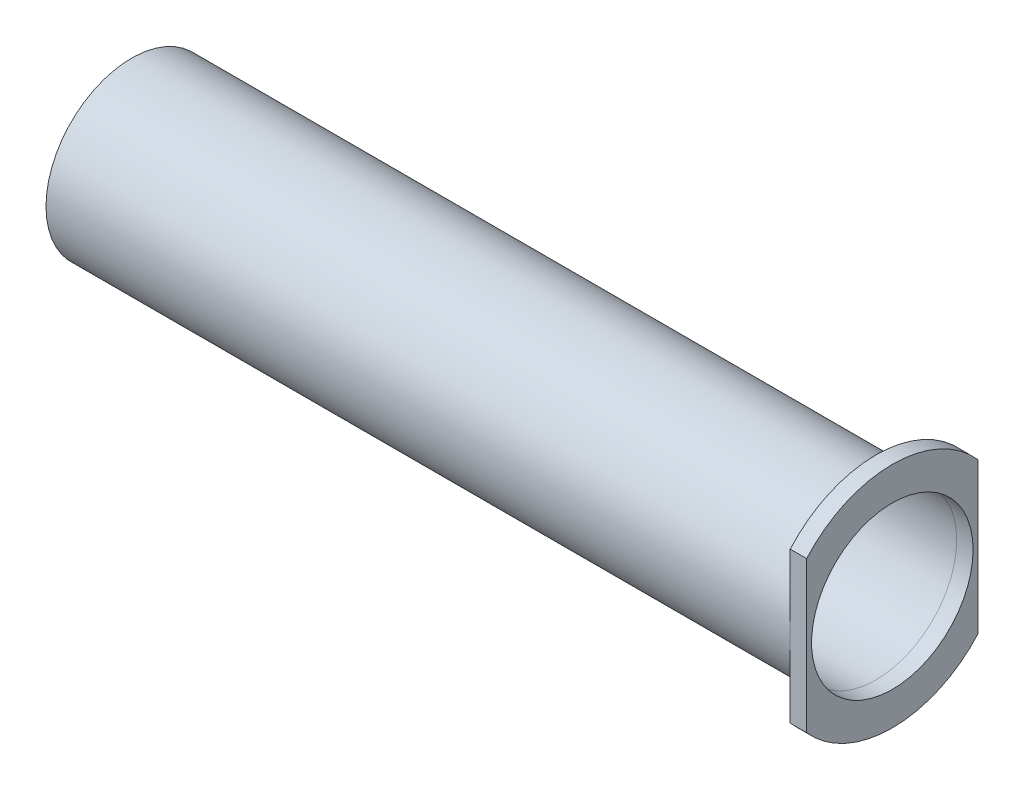
ISO-10303-21;
HEADER;
FILE_DESCRIPTION(('STEP AP214'),'2;1');
FILE_NAME('part.step','',(''),(''),'','','');
FILE_SCHEMA(('AUTOMOTIVE_DESIGN { 1 0 10303 214 1 1 1 1 }'));
ENDSEC;
DATA;
#1=APPLICATION_CONTEXT('core data for automotive mechanical design processes');
#2=APPLICATION_PROTOCOL_DEFINITION('international standard','automotive_design',2000,#1);
#3=PRODUCT_CONTEXT('',#1,'mechanical');
#4=PRODUCT('Part','Part','',(#3));
#5=PRODUCT_RELATED_PRODUCT_CATEGORY('part','',(#4));
#6=PRODUCT_DEFINITION_FORMATION('','',#4);
#7=PRODUCT_DEFINITION_CONTEXT('part definition',#1,'design');
#8=PRODUCT_DEFINITION('design','',#6,#7);
#9=PRODUCT_DEFINITION_SHAPE('','',#8);
#10=(LENGTH_UNIT() NAMED_UNIT(*) SI_UNIT(.MILLI.,.METRE.));
#11=(NAMED_UNIT(*) PLANE_ANGLE_UNIT() SI_UNIT($,.RADIAN.));
#12=(NAMED_UNIT(*) SI_UNIT($,.STERADIAN.) SOLID_ANGLE_UNIT());
#13=UNCERTAINTY_MEASURE_WITH_UNIT(LENGTH_MEASURE(1.E-05),#10,'distance_accuracy_value','');
#14=(GEOMETRIC_REPRESENTATION_CONTEXT(3) GLOBAL_UNCERTAINTY_ASSIGNED_CONTEXT((#13)) GLOBAL_UNIT_ASSIGNED_CONTEXT((#10,
#11,#12)) REPRESENTATION_CONTEXT('',''));
#15=CARTESIAN_POINT('',(0.,0.,0.));
#16=DIRECTION('',(0.,0.,1.));
#17=DIRECTION('',(1.,0.,0.));
#18=AXIS2_PLACEMENT_3D('',#15,#16,#17);
#19=CARTESIAN_POINT('',(160.35,0.,-17.5));
#20=DIRECTION('',(0.,0.,1.));
#21=DIRECTION('',(0.,-1.,0.));
#22=AXIS2_PLACEMENT_3D('',#19,#20,#21);
#23=PLANE('',#22);
#24=DIRECTION('',(0.,1.,0.));
#25=VECTOR('',#24,1.);
#26=CARTESIAN_POINT('',(157.,0.,-17.5));
#27=LINE('',#26,#25);
#28=CARTESIAN_POINT('',(157.,-15.3982499005569,-17.5));
#29=VERTEX_POINT('',#28);
#30=CARTESIAN_POINT('',(157.,15.3982499005569,-17.5));
#31=VERTEX_POINT('',#30);
#32=EDGE_CURVE('E119',#29,#31,#27,.T.);
#33=ORIENTED_EDGE('',*,*,#32,.T.);
#34=DIRECTION('',(-1.,0.,0.));
#35=VECTOR('',#34,1.);
#36=CARTESIAN_POINT('',(160.35,15.3982499005569,-17.5));
#37=LINE('',#36,#35);
#38=CARTESIAN_POINT('',(160.35,15.3982499005569,-17.5));
#39=VERTEX_POINT('',#38);
#40=EDGE_CURVE('E12',#39,#31,#37,.T.);
#41=ORIENTED_EDGE('',*,*,#40,.F.);
#42=DIRECTION('',(0.,1.,0.));
#43=VECTOR('',#42,1.);
#44=CARTESIAN_POINT('',(160.35,0.,-17.5));
#45=LINE('',#44,#43);
#46=CARTESIAN_POINT('',(160.35,-15.3982499005569,-17.5));
#47=VERTEX_POINT('',#46);
#48=EDGE_CURVE('E101',#47,#39,#45,.T.);
#49=ORIENTED_EDGE('',*,*,#48,.F.);
#50=DIRECTION('',(-1.,0.,0.));
#51=VECTOR('',#50,1.);
#52=CARTESIAN_POINT('',(160.35,-15.3982499005569,-17.5));
#53=LINE('',#52,#51);
#54=EDGE_CURVE('E118',#47,#29,#53,.T.);
#55=ORIENTED_EDGE('',*,*,#54,.T.);
#56=EDGE_LOOP('',(#33,#41,#49,#55));
#57=FACE_BOUND('',#56,.T.);
#58=ADVANCED_FACE('F53',(#57),#23,.F.);
#59=CARTESIAN_POINT('',(160.35,0.,0.));
#60=DIRECTION('',(-1.,0.,0.));
#61=DIRECTION('',(0.,0.,1.));
#62=AXIS2_PLACEMENT_3D('',#59,#60,#61);
#63=CYLINDRICAL_SURFACE('',#62,23.31);
#64=CARTESIAN_POINT('',(157.,0.,0.));
#65=DIRECTION('',(1.,0.,0.));
#66=DIRECTION('',(0.,0.,-1.));
#67=AXIS2_PLACEMENT_3D('',#64,#65,#66);
#68=CIRCLE('',#67,23.31);
#69=CARTESIAN_POINT('',(157.,15.3982499005569,17.5));
#70=VERTEX_POINT('',#69);
#71=EDGE_CURVE('E106',#31,#70,#68,.T.);
#72=ORIENTED_EDGE('',*,*,#71,.T.);
#73=DIRECTION('',(-1.,0.,0.));
#74=VECTOR('',#73,1.);
#75=CARTESIAN_POINT('',(160.35,15.3982499005569,17.5));
#76=LINE('',#75,#74);
#77=CARTESIAN_POINT('',(160.35,15.3982499005569,17.5));
#78=VERTEX_POINT('',#77);
#79=EDGE_CURVE('E61',#78,#70,#76,.T.);
#80=ORIENTED_EDGE('',*,*,#79,.F.);
#81=CARTESIAN_POINT('',(160.35,0.,0.));
#82=DIRECTION('',(1.,0.,0.));
#83=DIRECTION('',(0.,0.,-1.));
#84=AXIS2_PLACEMENT_3D('',#81,#82,#83);
#85=CIRCLE('',#84,23.31);
#86=EDGE_CURVE('E95',#39,#78,#85,.T.);
#87=ORIENTED_EDGE('',*,*,#86,.F.);
#88=ORIENTED_EDGE('',*,*,#40,.T.);
#89=EDGE_LOOP('',(#72,#80,#87,#88));
#90=FACE_BOUND('',#89,.T.);
#91=ADVANCED_FACE('F105',(#90),#63,.T.);
#92=CARTESIAN_POINT('',(160.35,0.,17.5));
#93=DIRECTION('',(0.,0.,1.));
#94=DIRECTION('',(0.,-1.,0.));
#95=AXIS2_PLACEMENT_3D('',#92,#93,#94);
#96=PLANE('',#95);
#97=DIRECTION('',(0.,1.,0.));
#98=VECTOR('',#97,1.);
#99=CARTESIAN_POINT('',(157.,0.,17.5));
#100=LINE('',#99,#98);
#101=CARTESIAN_POINT('',(157.,-15.3982499005569,17.5));
#102=VERTEX_POINT('',#101);
#103=EDGE_CURVE('E123',#102,#70,#100,.T.);
#104=ORIENTED_EDGE('',*,*,#103,.F.);
#105=DIRECTION('',(-1.,0.,0.));
#106=VECTOR('',#105,1.);
#107=CARTESIAN_POINT('',(160.35,-15.3982499005569,17.5));
#108=LINE('',#107,#106);
#109=CARTESIAN_POINT('',(160.35,-15.3982499005569,17.5));
#110=VERTEX_POINT('',#109);
#111=EDGE_CURVE('E85',#110,#102,#108,.T.);
#112=ORIENTED_EDGE('',*,*,#111,.F.);
#113=DIRECTION('',(0.,1.,0.));
#114=VECTOR('',#113,1.);
#115=CARTESIAN_POINT('',(160.35,0.,17.5));
#116=LINE('',#115,#114);
#117=EDGE_CURVE('E99',#110,#78,#116,.T.);
#118=ORIENTED_EDGE('',*,*,#117,.T.);
#119=ORIENTED_EDGE('',*,*,#79,.T.);
#120=EDGE_LOOP('',(#104,#112,#118,#119));
#121=FACE_BOUND('',#120,.T.);
#122=ADVANCED_FACE('F110',(#121),#96,.T.);
#123=CARTESIAN_POINT('',(160.35,0.,0.));
#124=DIRECTION('',(-1.,0.,0.));
#125=DIRECTION('',(0.,0.,1.));
#126=AXIS2_PLACEMENT_3D('',#123,#124,#125);
#127=CYLINDRICAL_SURFACE('',#126,23.31);
#128=CARTESIAN_POINT('',(157.,0.,0.));
#129=DIRECTION('',(1.,0.,0.));
#130=DIRECTION('',(0.,0.,-1.));
#131=AXIS2_PLACEMENT_3D('',#128,#129,#130);
#132=CIRCLE('',#131,23.31);
#133=EDGE_CURVE('E88',#102,#29,#132,.T.);
#134=ORIENTED_EDGE('',*,*,#133,.T.);
#135=ORIENTED_EDGE('',*,*,#54,.F.);
#136=CARTESIAN_POINT('',(160.35,0.,0.));
#137=DIRECTION('',(1.,0.,0.));
#138=DIRECTION('',(0.,0.,-1.));
#139=AXIS2_PLACEMENT_3D('',#136,#137,#138);
#140=CIRCLE('',#139,23.31);
#141=EDGE_CURVE('E69',#110,#47,#140,.T.);
#142=ORIENTED_EDGE('',*,*,#141,.F.);
#143=ORIENTED_EDGE('',*,*,#111,.T.);
#144=EDGE_LOOP('',(#134,#135,#142,#143));
#145=FACE_BOUND('',#144,.T.);
#146=ADVANCED_FACE('F141',(#145),#127,.T.);
#147=CARTESIAN_POINT('',(160.35,0.,0.));
#148=DIRECTION('',(-1.,0.,0.));
#149=DIRECTION('',(0.,0.,1.));
#150=AXIS2_PLACEMENT_3D('',#147,#148,#149);
#151=CYLINDRICAL_SURFACE('',#150,16.5);
#152=CARTESIAN_POINT('',(160.35,0.,0.));
#153=DIRECTION('',(1.,0.,0.));
#154=DIRECTION('',(0.,0.,-1.));
#155=AXIS2_PLACEMENT_3D('',#152,#153,#154);
#156=CIRCLE('',#155,16.5);
#157=CARTESIAN_POINT('',(160.35,0.,-16.5));
#158=VERTEX_POINT('',#157);
#159=EDGE_CURVE('E112',#158,#158,#156,.F.);
#160=ORIENTED_EDGE('',*,*,#159,.F.);
#161=EDGE_LOOP('',(#160));
#162=FACE_BOUND('',#161,.T.);
#163=CARTESIAN_POINT('',(157.,0.,0.));
#164=DIRECTION('',(1.,0.,0.));
#165=DIRECTION('',(0.,0.,-1.));
#166=AXIS2_PLACEMENT_3D('',#163,#164,#165);
#167=CIRCLE('',#166,16.5);
#168=CARTESIAN_POINT('',(157.,0.,-16.5));
#169=VERTEX_POINT('',#168);
#170=EDGE_CURVE('E126',#169,#169,#167,.F.);
#171=ORIENTED_EDGE('',*,*,#170,.T.);
#172=EDGE_LOOP('',(#171));
#173=FACE_BOUND('',#172,.T.);
#174=ADVANCED_FACE('F139',(#162,#173),#151,.F.);
#175=CARTESIAN_POINT('',(160.35,0.,0.));
#176=DIRECTION('',(1.,0.,0.));
#177=DIRECTION('',(0.,0.,-1.));
#178=AXIS2_PLACEMENT_3D('',#175,#176,#177);
#179=PLANE('',#178);
#180=ORIENTED_EDGE('',*,*,#48,.T.);
#181=ORIENTED_EDGE('',*,*,#86,.T.);
#182=ORIENTED_EDGE('',*,*,#117,.F.);
#183=ORIENTED_EDGE('',*,*,#141,.T.);
#184=EDGE_LOOP('',(#180,#181,#182,#183));
#185=FACE_BOUND('',#184,.T.);
#186=ORIENTED_EDGE('',*,*,#159,.T.);
#187=EDGE_LOOP('',(#186));
#188=FACE_BOUND('',#187,.T.);
#189=ADVANCED_FACE('F96',(#185,#188),#179,.T.);
#190=CARTESIAN_POINT('',(157.,0.,0.));
#191=DIRECTION('',(1.,0.,0.));
#192=DIRECTION('',(0.,0.,-1.));
#193=AXIS2_PLACEMENT_3D('',#190,#191,#192);
#194=PLANE('',#193);
#195=ORIENTED_EDGE('',*,*,#32,.F.);
#196=ORIENTED_EDGE('',*,*,#133,.F.);
#197=ORIENTED_EDGE('',*,*,#103,.T.);
#198=ORIENTED_EDGE('',*,*,#71,.F.);
#199=EDGE_LOOP('',(#195,#196,#197,#198));
#200=FACE_BOUND('',#199,.T.);
#201=ORIENTED_EDGE('',*,*,#170,.F.);
#202=EDGE_LOOP('',(#201));
#203=FACE_BOUND('',#202,.T.);
#204=ADVANCED_FACE('F133',(#200,#203),#194,.F.);
#205=CLOSED_SHELL('',(#58,#91,#122,#146,#174,#189,#204));
#206=MANIFOLD_SOLID_BREP('B2',#205);
#207=CARTESIAN_POINT('',(-45.,0.,0.));
#208=DIRECTION('',(1.,0.,0.));
#209=DIRECTION('',(0.,0.,-1.));
#210=AXIS2_PLACEMENT_3D('',#207,#208,#209);
#211=CYLINDRICAL_SURFACE('',#210,3.75);
#212=CARTESIAN_POINT('',(0.,0.,0.));
#213=DIRECTION('',(1.,0.,0.));
#214=DIRECTION('',(0.,0.,-1.));
#215=AXIS2_PLACEMENT_3D('',#212,#213,#214);
#216=CIRCLE('',#215,3.75);
#217=CARTESIAN_POINT('',(0.,0.,-3.75));
#218=VERTEX_POINT('',#217);
#219=EDGE_CURVE('E254',#218,#218,#216,.F.);
#220=CARTESIAN_POINT('',(8.00000000000001,0.,0.));
#221=DIRECTION('',(1.,0.,0.));
#222=DIRECTION('',(0.,0.,-1.));
#223=AXIS2_PLACEMENT_3D('',#220,#221,#222);
#224=CIRCLE('',#223,3.75);
#225=CARTESIAN_POINT('',(8.00000000000001,0.,-3.75));
#226=VERTEX_POINT('',#225);
#227=EDGE_CURVE('E234',#226,#226,#224,.T.);
#228=CARTESIAN_POINT('',(0.,0.,-3.75));
#229=CARTESIAN_POINT('',(0.0833333333333333,0.,-3.75));
#230=CARTESIAN_POINT('',(0.166666666666667,0.,-3.75));
#231=CARTESIAN_POINT('',(0.333333333333334,0.,-3.75));
#232=CARTESIAN_POINT('',(0.416666666666667,0.,-3.75));
#233=CARTESIAN_POINT('',(0.583333333333334,0.,-3.75));
#234=CARTESIAN_POINT('',(0.666666666666667,0.,-3.75));
#235=CARTESIAN_POINT('',(0.833333333333334,0.,-3.75));
#236=CARTESIAN_POINT('',(0.916666666666668,0.,-3.75));
#237=CARTESIAN_POINT('',(1.08333333333333,0.,-3.75));
#238=CARTESIAN_POINT('',(1.16666666666667,0.,-3.75));
#239=CARTESIAN_POINT('',(1.33333333333333,0.,-3.75));
#240=CARTESIAN_POINT('',(1.41666666666667,0.,-3.75));
#241=CARTESIAN_POINT('',(1.58333333333333,0.,-3.75));
#242=CARTESIAN_POINT('',(1.66666666666667,0.,-3.75));
#243=CARTESIAN_POINT('',(1.83333333333334,0.,-3.75));
#244=CARTESIAN_POINT('',(1.91666666666667,0.,-3.75));
#245=CARTESIAN_POINT('',(2.08333333333334,0.,-3.75));
#246=CARTESIAN_POINT('',(2.16666666666667,0.,-3.75));
#247=CARTESIAN_POINT('',(2.33333333333334,0.,-3.75));
#248=CARTESIAN_POINT('',(2.41666666666667,0.,-3.75));
#249=CARTESIAN_POINT('',(2.58333333333334,0.,-3.75));
#250=CARTESIAN_POINT('',(2.66666666666667,0.,-3.75));
#251=CARTESIAN_POINT('',(2.83333333333334,0.,-3.75));
#252=CARTESIAN_POINT('',(2.91666666666667,0.,-3.75));
#253=CARTESIAN_POINT('',(3.08333333333334,0.,-3.75));
#254=CARTESIAN_POINT('',(3.16666666666667,0.,-3.75));
#255=CARTESIAN_POINT('',(3.33333333333334,0.,-3.75));
#256=CARTESIAN_POINT('',(3.41666666666667,0.,-3.75));
#257=CARTESIAN_POINT('',(3.58333333333334,0.,-3.75));
#258=CARTESIAN_POINT('',(3.66666666666667,0.,-3.75));
#259=CARTESIAN_POINT('',(3.83333333333334,0.,-3.75));
#260=CARTESIAN_POINT('',(3.91666666666667,0.,-3.75));
#261=CARTESIAN_POINT('',(4.08333333333334,0.,-3.75));
#262=CARTESIAN_POINT('',(4.16666666666667,0.,-3.75));
#263=CARTESIAN_POINT('',(4.33333333333334,0.,-3.75));
#264=CARTESIAN_POINT('',(4.41666666666667,0.,-3.75));
#265=CARTESIAN_POINT('',(4.58333333333334,0.,-3.75));
#266=CARTESIAN_POINT('',(4.66666666666667,0.,-3.75));
#267=CARTESIAN_POINT('',(4.83333333333334,0.,-3.75));
#268=CARTESIAN_POINT('',(4.91666666666667,0.,-3.75));
#269=CARTESIAN_POINT('',(5.08333333333334,0.,-3.75));
#270=CARTESIAN_POINT('',(5.16666666666667,0.,-3.75));
#271=CARTESIAN_POINT('',(5.33333333333334,0.,-3.75));
#272=CARTESIAN_POINT('',(5.41666666666667,0.,-3.75));
#273=CARTESIAN_POINT('',(5.58333333333334,0.,-3.75));
#274=CARTESIAN_POINT('',(5.66666666666667,0.,-3.75));
#275=CARTESIAN_POINT('',(5.83333333333334,0.,-3.75));
#276=CARTESIAN_POINT('',(5.91666666666667,0.,-3.75));
#277=CARTESIAN_POINT('',(6.08333333333334,0.,-3.75));
#278=CARTESIAN_POINT('',(6.16666666666667,0.,-3.75));
#279=CARTESIAN_POINT('',(6.33333333333334,0.,-3.75));
#280=CARTESIAN_POINT('',(6.41666666666667,0.,-3.75));
#281=CARTESIAN_POINT('',(6.58333333333334,0.,-3.75));
#282=CARTESIAN_POINT('',(6.66666666666667,0.,-3.75));
#283=CARTESIAN_POINT('',(6.83333333333334,0.,-3.75));
#284=CARTESIAN_POINT('',(6.91666666666667,0.,-3.75));
#285=CARTESIAN_POINT('',(7.08333333333334,0.,-3.75));
#286=CARTESIAN_POINT('',(7.16666666666667,0.,-3.75));
#287=CARTESIAN_POINT('',(7.33333333333334,0.,-3.75));
#288=CARTESIAN_POINT('',(7.41666666666667,0.,-3.75));
#289=CARTESIAN_POINT('',(7.58333333333334,0.,-3.75));
#290=CARTESIAN_POINT('',(7.66666666666667,0.,-3.75));
#291=CARTESIAN_POINT('',(7.83333333333334,0.,-3.75));
#292=CARTESIAN_POINT('',(7.91666666666667,0.,-3.75));
#293=CARTESIAN_POINT('',(8.00000000000001,0.,-3.75));
#294=B_SPLINE_CURVE_WITH_KNOTS('',3,(#228,#229,#230,#231,#232,#233,#234,#235,#236,#237,#238,
#239,#240,#241,#242,#243,#244,#245,#246,#247,#248,#249,#250,#251,#252,#253,#254,#255,#256,#257,
#258,#259,#260,#261,#262,#263,#264,#265,#266,#267,#268,#269,#270,#271,#272,#273,#274,#275,#276,
#277,#278,#279,#280,#281,#282,#283,#284,#285,#286,#287,#288,#289,#290,#291,#292,#293),
.UNSPECIFIED.,.F.,.F.,(4,2,2,2,2,2,2,2,2,2,2,2,2,2,2,2,2,2,2,2,2,2,2,2,2,2,2,2,2,2,2,2,4),(0.,
0.25,0.5,0.750000000000001,1.,1.25,1.5,1.75,2.,2.25,2.5,2.75,3.,3.25,3.5,3.75,4.,4.25,4.5,4.75,
5.,5.25,5.50000000000001,5.75000000000001,6.00000000000001,6.25000000000001,6.50000000000001,
6.75000000000001,7.00000000000001,7.25000000000001,7.50000000000001,7.75000000000001,
8.00000000000001),.UNSPECIFIED.);
#295=EDGE_CURVE('BSEAM230',#218,#226,#294,.T.);
#296=ORIENTED_EDGE('',*,*,#219,.T.);
#297=ORIENTED_EDGE('',*,*,#227,.T.);
#298=ORIENTED_EDGE('',*,*,#295,.T.);
#299=ORIENTED_EDGE('',*,*,#295,.F.);
#300=EDGE_LOOP('',(#296,#298,#297,#299));
#301=FACE_BOUND('',#300,.T.);
#302=ADVANCED_FACE('F230',(#301),#211,.F.);
#303=CARTESIAN_POINT('',(0.,4.75,0.));
#304=DIRECTION('',(1.,0.,0.));
#305=DIRECTION('',(0.,0.,-1.));
#306=AXIS2_PLACEMENT_3D('',#303,#304,#305);
#307=PLANE('',#306);
#308=ORIENTED_EDGE('',*,*,#219,.F.);
#309=EDGE_LOOP('',(#308));
#310=FACE_BOUND('',#309,.T.);
#311=CARTESIAN_POINT('',(0.,0.,0.));
#312=DIRECTION('',(-1.,0.,0.));
#313=DIRECTION('',(0.,0.,1.));
#314=AXIS2_PLACEMENT_3D('',#311,#312,#313);
#315=CIRCLE('',#314,4.75);
#316=CARTESIAN_POINT('',(0.,0.,4.75));
#317=VERTEX_POINT('',#316);
#318=EDGE_CURVE('E250',#317,#317,#315,.T.);
#319=ORIENTED_EDGE('',*,*,#318,.T.);
#320=EDGE_LOOP('',(#319));
#321=FACE_BOUND('',#320,.T.);
#322=ADVANCED_FACE('F232',(#310,#321),#307,.F.);
#323=CARTESIAN_POINT('',(157.,17.5,0.));
#324=DIRECTION('',(-1.,0.,0.));
#325=DIRECTION('',(0.,0.,1.));
#326=AXIS2_PLACEMENT_3D('',#323,#324,#325);
#327=PLANE('',#326);
#328=CARTESIAN_POINT('',(157.,0.,0.));
#329=DIRECTION('',(1.,0.,0.));
#330=DIRECTION('',(0.,0.,-1.));
#331=AXIS2_PLACEMENT_3D('',#328,#329,#330);
#332=CIRCLE('',#331,16.5);
#333=CARTESIAN_POINT('',(157.,0.,-16.5));
#334=VERTEX_POINT('',#333);
#335=EDGE_CURVE('E258',#334,#334,#332,.T.);
#336=ORIENTED_EDGE('',*,*,#335,.F.);
#337=EDGE_LOOP('',(#336));
#338=FACE_BOUND('',#337,.T.);
#339=CARTESIAN_POINT('',(157.,0.,0.));
#340=DIRECTION('',(-1.,0.,0.));
#341=DIRECTION('',(0.,0.,1.));
#342=AXIS2_PLACEMENT_3D('',#339,#340,#341);
#343=CIRCLE('',#342,17.5);
#344=CARTESIAN_POINT('',(157.,0.,17.5));
#345=VERTEX_POINT('',#344);
#346=EDGE_CURVE('E52',#345,#345,#343,.T.);
#347=ORIENTED_EDGE('',*,*,#346,.F.);
#348=EDGE_LOOP('',(#347));
#349=FACE_BOUND('',#348,.T.);
#350=ADVANCED_FACE('F288',(#338,#349),#327,.F.);
#351=CARTESIAN_POINT('',(0.,0.,0.));
#352=DIRECTION('',(-1.,0.,0.));
#353=DIRECTION('',(0.,0.,1.));
#354=AXIS2_PLACEMENT_3D('',#351,#352,#353);
#355=CYLINDRICAL_SURFACE('',#354,17.5);
#356=CARTESIAN_POINT('',(5.,0.,0.));
#357=DIRECTION('',(-1.,0.,0.));
#358=DIRECTION('',(0.,0.,1.));
#359=AXIS2_PLACEMENT_3D('',#356,#357,#358);
#360=CIRCLE('',#359,17.5);
#361=CARTESIAN_POINT('',(5.,0.,17.5));
#362=VERTEX_POINT('',#361);
#363=EDGE_CURVE('E239',#362,#362,#360,.T.);
#364=ORIENTED_EDGE('',*,*,#363,.F.);
#365=EDGE_LOOP('',(#364));
#366=FACE_BOUND('',#365,.T.);
#367=ORIENTED_EDGE('',*,*,#346,.T.);
#368=EDGE_LOOP('',(#367));
#369=FACE_BOUND('',#368,.T.);
#370=ADVANCED_FACE('F297',(#366,#369),#355,.T.);
#371=CARTESIAN_POINT('',(5.,17.5,0.));
#372=DIRECTION('',(1.,0.,0.));
#373=DIRECTION('',(0.,0.,-1.));
#374=AXIS2_PLACEMENT_3D('',#371,#372,#373);
#375=PLANE('',#374);
#376=CARTESIAN_POINT('',(5.,0.,0.));
#377=DIRECTION('',(-1.,0.,0.));
#378=DIRECTION('',(0.,0.,1.));
#379=AXIS2_PLACEMENT_3D('',#376,#377,#378);
#380=CIRCLE('',#379,4.75);
#381=CARTESIAN_POINT('',(5.,0.,4.75));
#382=VERTEX_POINT('',#381);
#383=EDGE_CURVE('E244',#382,#382,#380,.T.);
#384=ORIENTED_EDGE('',*,*,#383,.F.);
#385=EDGE_LOOP('',(#384));
#386=FACE_BOUND('',#385,.T.);
#387=ORIENTED_EDGE('',*,*,#363,.T.);
#388=EDGE_LOOP('',(#387));
#389=FACE_BOUND('',#388,.T.);
#390=ADVANCED_FACE('F293',(#386,#389),#375,.F.);
#391=CARTESIAN_POINT('',(0.,0.,0.));
#392=DIRECTION('',(-1.,0.,0.));
#393=DIRECTION('',(0.,0.,1.));
#394=AXIS2_PLACEMENT_3D('',#391,#392,#393);
#395=CYLINDRICAL_SURFACE('',#394,4.75);
#396=ORIENTED_EDGE('',*,*,#318,.F.);
#397=EDGE_LOOP('',(#396));
#398=FACE_BOUND('',#397,.T.);
#399=ORIENTED_EDGE('',*,*,#383,.T.);
#400=EDGE_LOOP('',(#399));
#401=FACE_BOUND('',#400,.T.);
#402=ADVANCED_FACE('F279',(#398,#401),#395,.T.);
#403=CARTESIAN_POINT('',(8.00000000000001,0.,0.));
#404=DIRECTION('',(1.,0.,0.));
#405=DIRECTION('',(0.,0.,-1.));
#406=AXIS2_PLACEMENT_3D('',#403,#404,#405);
#407=CYLINDRICAL_SURFACE('',#406,16.5);
#408=CARTESIAN_POINT('',(8.00000000000001,0.,0.));
#409=DIRECTION('',(1.,0.,0.));
#410=DIRECTION('',(0.,0.,-1.));
#411=AXIS2_PLACEMENT_3D('',#408,#409,#410);
#412=CIRCLE('',#411,16.5);
#413=CARTESIAN_POINT('',(8.00000000000001,0.,-16.5));
#414=VERTEX_POINT('',#413);
#415=EDGE_CURVE('E262',#414,#414,#412,.T.);
#416=ORIENTED_EDGE('',*,*,#415,.F.);
#417=EDGE_LOOP('',(#416));
#418=FACE_BOUND('',#417,.T.);
#419=ORIENTED_EDGE('',*,*,#335,.T.);
#420=EDGE_LOOP('',(#419));
#421=FACE_BOUND('',#420,.T.);
#422=ADVANCED_FACE('F274',(#418,#421),#407,.F.);
#423=CARTESIAN_POINT('',(8.00000000000001,0.,0.));
#424=DIRECTION('',(1.,0.,0.));
#425=DIRECTION('',(0.,0.,-1.));
#426=AXIS2_PLACEMENT_3D('',#423,#424,#425);
#427=PLANE('',#426);
#428=ORIENTED_EDGE('',*,*,#227,.F.);
#429=EDGE_LOOP('',(#428));
#430=FACE_BOUND('',#429,.T.);
#431=ORIENTED_EDGE('',*,*,#415,.T.);
#432=EDGE_LOOP('',(#431));
#433=FACE_BOUND('',#432,.T.);
#434=ADVANCED_FACE('F272',(#430,#433),#427,.T.);
#435=CLOSED_SHELL('',(#302,#322,#350,#370,#390,#402,#422,#434));
#436=MANIFOLD_SOLID_BREP('B6',#435);
#437=ADVANCED_BREP_SHAPE_REPRESENTATION('',(#18,#206,#436),#14);
#438=SHAPE_DEFINITION_REPRESENTATION(#9,#437);
ENDSEC;
END-ISO-10303-21;
